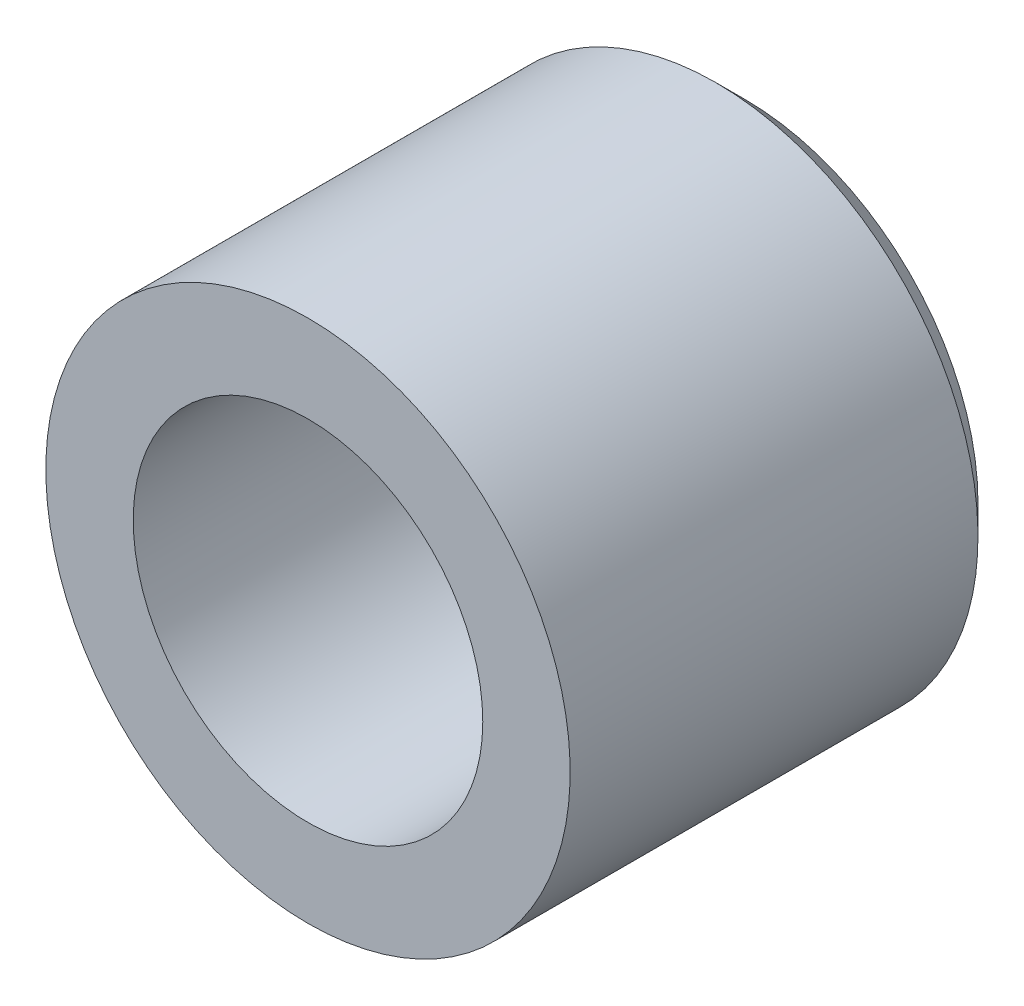
ISO-10303-21;
HEADER;
FILE_DESCRIPTION(('STEP AP214'),'2;1');
FILE_NAME('part.step','',(''),(''),'','','');
FILE_SCHEMA(('AUTOMOTIVE_DESIGN { 1 0 10303 214 1 1 1 1 }'));
ENDSEC;
DATA;
#1=APPLICATION_CONTEXT('core data for automotive mechanical design processes');
#2=APPLICATION_PROTOCOL_DEFINITION('international standard','automotive_design',2000,#1);
#3=PRODUCT_CONTEXT('',#1,'mechanical');
#4=PRODUCT('Part','Part','',(#3));
#5=PRODUCT_RELATED_PRODUCT_CATEGORY('part','',(#4));
#6=PRODUCT_DEFINITION_FORMATION('','',#4);
#7=PRODUCT_DEFINITION_CONTEXT('part definition',#1,'design');
#8=PRODUCT_DEFINITION('design','',#6,#7);
#9=PRODUCT_DEFINITION_SHAPE('','',#8);
#10=(LENGTH_UNIT() NAMED_UNIT(*) SI_UNIT(.MILLI.,.METRE.));
#11=(NAMED_UNIT(*) PLANE_ANGLE_UNIT() SI_UNIT($,.RADIAN.));
#12=(NAMED_UNIT(*) SI_UNIT($,.STERADIAN.) SOLID_ANGLE_UNIT());
#13=UNCERTAINTY_MEASURE_WITH_UNIT(LENGTH_MEASURE(1.E-05),#10,'distance_accuracy_value','');
#14=(GEOMETRIC_REPRESENTATION_CONTEXT(3) GLOBAL_UNCERTAINTY_ASSIGNED_CONTEXT((#13)) GLOBAL_UNIT_ASSIGNED_CONTEXT((#10,
#11,#12)) REPRESENTATION_CONTEXT('',''));
#15=CARTESIAN_POINT('',(0.,0.,0.));
#16=DIRECTION('',(0.,0.,1.));
#17=DIRECTION('',(1.,0.,0.));
#18=AXIS2_PLACEMENT_3D('',#15,#16,#17);
#19=CARTESIAN_POINT('',(0.,0.,0.));
#20=DIRECTION('',(0.,0.,-1.));
#21=DIRECTION('',(0.,1.,0.));
#22=AXIS2_PLACEMENT_3D('',#19,#20,#21);
#23=CYLINDRICAL_SURFACE('',#22,6.);
#24=CARTESIAN_POINT('',(0.,0.,1.5));
#25=DIRECTION('',(0.,0.,-1.));
#26=DIRECTION('',(0.,1.,0.));
#27=AXIS2_PLACEMENT_3D('',#24,#25,#26);
#28=CIRCLE('',#27,6.);
#29=CARTESIAN_POINT('',(0.,6.,1.5));
#30=VERTEX_POINT('',#29);
#31=EDGE_CURVE('E45',#30,#30,#28,.T.);
#32=ORIENTED_EDGE('',*,*,#31,.T.);
#33=EDGE_LOOP('',(#32));
#34=FACE_BOUND('',#33,.T.);
#35=CARTESIAN_POINT('',(0.,0.,15.));
#36=DIRECTION('',(0.,0.,1.));
#37=DIRECTION('',(1.,0.,0.));
#38=AXIS2_PLACEMENT_3D('',#35,#36,#37);
#39=CIRCLE('',#38,6.);
#40=CARTESIAN_POINT('',(6.,0.,15.));
#41=VERTEX_POINT('',#40);
#42=EDGE_CURVE('E58',#41,#41,#39,.F.);
#43=ORIENTED_EDGE('',*,*,#42,.F.);
#44=EDGE_LOOP('',(#43));
#45=FACE_BOUND('',#44,.T.);
#46=ADVANCED_FACE('F38',(#34,#45),#23,.F.);
#47=CARTESIAN_POINT('',(0.,0.,0.));
#48=DIRECTION('',(0.,0.,-1.));
#49=DIRECTION('',(0.,1.,0.));
#50=AXIS2_PLACEMENT_3D('',#47,#48,#49);
#51=CYLINDRICAL_SURFACE('',#50,9.);
#52=CARTESIAN_POINT('',(0.,0.,1.00000000000001));
#53=DIRECTION('',(0.,0.,-1.));
#54=DIRECTION('',(0.,1.,0.));
#55=AXIS2_PLACEMENT_3D('',#52,#53,#54);
#56=CIRCLE('',#55,9.);
#57=CARTESIAN_POINT('',(0.,9.,1.00000000000001));
#58=VERTEX_POINT('',#57);
#59=EDGE_CURVE('E49',#58,#58,#56,.F.);
#60=ORIENTED_EDGE('',*,*,#59,.T.);
#61=EDGE_LOOP('',(#60));
#62=FACE_BOUND('',#61,.T.);
#63=CARTESIAN_POINT('',(0.,0.,15.));
#64=DIRECTION('',(0.,0.,1.));
#65=DIRECTION('',(0.,-1.,0.));
#66=AXIS2_PLACEMENT_3D('',#63,#64,#65);
#67=CIRCLE('',#66,8.99999999999998);
#68=CARTESIAN_POINT('',(0.,-8.99999999999998,15.));
#69=VERTEX_POINT('',#68);
#70=EDGE_CURVE('E61',#69,#69,#67,.T.);
#71=ORIENTED_EDGE('',*,*,#70,.F.);
#72=EDGE_LOOP('',(#71));
#73=FACE_BOUND('',#72,.T.);
#74=ADVANCED_FACE('F67',(#62,#73),#51,.T.);
#75=CARTESIAN_POINT('',(0.,0.,0.));
#76=DIRECTION('',(0.,0.,-1.));
#77=DIRECTION('',(0.,1.,0.));
#78=AXIS2_PLACEMENT_3D('',#75,#76,#77);
#79=PLANE('',#78);
#80=CARTESIAN_POINT('',(0.,0.,0.));
#81=DIRECTION('',(0.,0.,-1.));
#82=DIRECTION('',(0.,1.,0.));
#83=AXIS2_PLACEMENT_3D('',#80,#81,#82);
#84=CIRCLE('',#83,7.5);
#85=CARTESIAN_POINT('',(0.,7.5,0.));
#86=VERTEX_POINT('',#85);
#87=EDGE_CURVE('E10',#86,#86,#84,.F.);
#88=ORIENTED_EDGE('',*,*,#87,.T.);
#89=EDGE_LOOP('',(#88));
#90=FACE_BOUND('',#89,.T.);
#91=CARTESIAN_POINT('',(0.,0.,0.));
#92=DIRECTION('',(0.,0.,-1.));
#93=DIRECTION('',(0.,1.,0.));
#94=AXIS2_PLACEMENT_3D('',#91,#92,#93);
#95=CIRCLE('',#94,7.99999999999999);
#96=CARTESIAN_POINT('',(0.,7.99999999999999,0.));
#97=VERTEX_POINT('',#96);
#98=EDGE_CURVE('E53',#97,#97,#95,.T.);
#99=ORIENTED_EDGE('',*,*,#98,.T.);
#100=EDGE_LOOP('',(#99));
#101=FACE_BOUND('',#100,.T.);
#102=ADVANCED_FACE('F69',(#90,#101),#79,.T.);
#103=CARTESIAN_POINT('',(0.,0.,15.));
#104=DIRECTION('',(0.,0.,1.));
#105=DIRECTION('',(1.,0.,0.));
#106=AXIS2_PLACEMENT_3D('',#103,#104,#105);
#107=PLANE('',#106);
#108=ORIENTED_EDGE('',*,*,#42,.T.);
#109=EDGE_LOOP('',(#108));
#110=FACE_BOUND('',#109,.T.);
#111=ORIENTED_EDGE('',*,*,#70,.T.);
#112=EDGE_LOOP('',(#111));
#113=FACE_BOUND('',#112,.T.);
#114=ADVANCED_FACE('F65',(#110,#113),#107,.T.);
#115=CARTESIAN_POINT('',(0.,0.,0.));
#116=DIRECTION('',(0.,0.,1.));
#117=DIRECTION('',(0.,-1.,0.));
#118=AXIS2_PLACEMENT_3D('',#115,#116,#117);
#119=CONICAL_SURFACE('',#118,7.99999999999999,0.785398163397447);
#120=ORIENTED_EDGE('',*,*,#59,.F.);
#121=EDGE_LOOP('',(#120));
#122=FACE_BOUND('',#121,.T.);
#123=ORIENTED_EDGE('',*,*,#98,.F.);
#124=EDGE_LOOP('',(#123));
#125=FACE_BOUND('',#124,.T.);
#126=ADVANCED_FACE('F81',(#122,#125),#119,.T.);
#127=CARTESIAN_POINT('',(0.,0.,1.5));
#128=DIRECTION('',(0.,0.,-1.));
#129=DIRECTION('',(0.,1.,0.));
#130=AXIS2_PLACEMENT_3D('',#127,#128,#129);
#131=TOROIDAL_SURFACE('',#130,7.5,1.5);
#132=ORIENTED_EDGE('',*,*,#87,.F.);
#133=EDGE_LOOP('',(#132));
#134=FACE_BOUND('',#133,.T.);
#135=ORIENTED_EDGE('',*,*,#31,.F.);
#136=EDGE_LOOP('',(#135));
#137=FACE_BOUND('',#136,.T.);
#138=ADVANCED_FACE('F40',(#134,#137),#131,.T.);
#139=CLOSED_SHELL('',(#46,#74,#102,#114,#126,#138));
#140=MANIFOLD_SOLID_BREP('B2',#139);
#141=ADVANCED_BREP_SHAPE_REPRESENTATION('',(#18,#140),#14);
#142=SHAPE_DEFINITION_REPRESENTATION(#9,#141);
ENDSEC;
END-ISO-10303-21;
